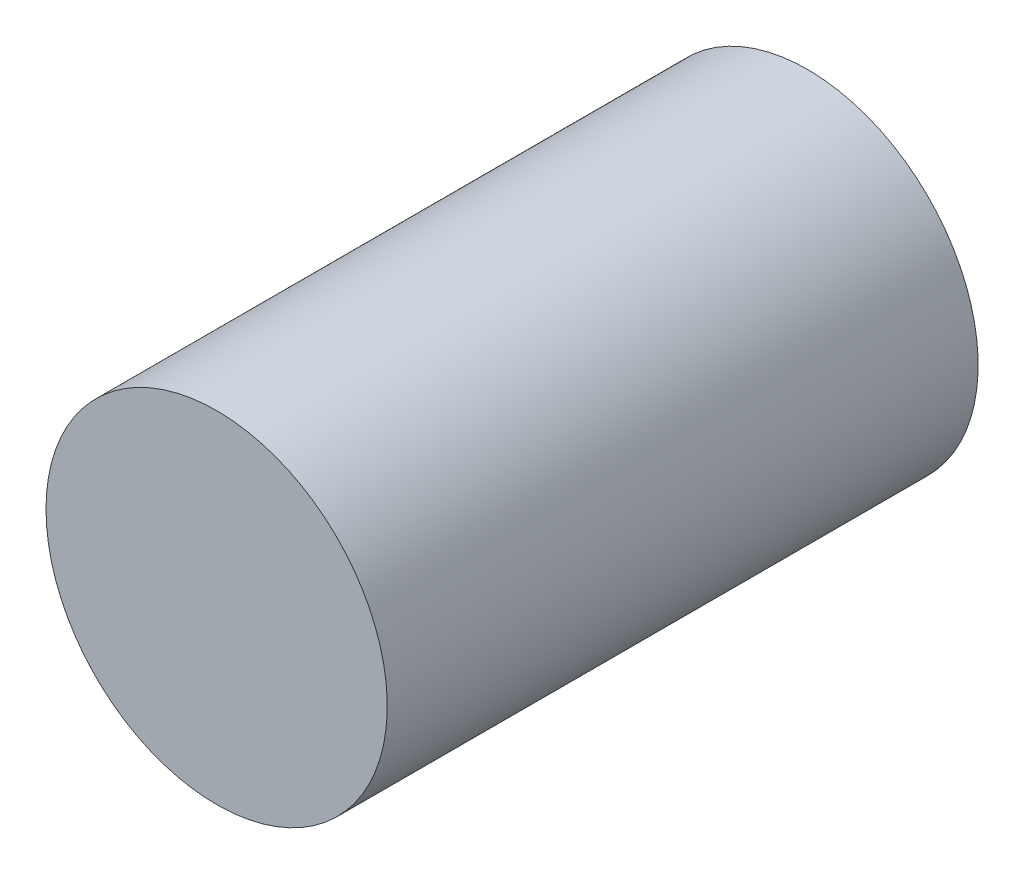
ISO-10303-21;
HEADER;
FILE_DESCRIPTION(('STEP AP214'),'2;1');
FILE_NAME('part.step','',(''),(''),'','','');
FILE_SCHEMA(('AUTOMOTIVE_DESIGN { 1 0 10303 214 1 1 1 1 }'));
ENDSEC;
DATA;
#1=APPLICATION_CONTEXT('core data for automotive mechanical design processes');
#2=APPLICATION_PROTOCOL_DEFINITION('international standard','automotive_design',2000,#1);
#3=PRODUCT_CONTEXT('',#1,'mechanical');
#4=PRODUCT('Part','Part','',(#3));
#5=PRODUCT_RELATED_PRODUCT_CATEGORY('part','',(#4));
#6=PRODUCT_DEFINITION_FORMATION('','',#4);
#7=PRODUCT_DEFINITION_CONTEXT('part definition',#1,'design');
#8=PRODUCT_DEFINITION('design','',#6,#7);
#9=PRODUCT_DEFINITION_SHAPE('','',#8);
#10=(LENGTH_UNIT() NAMED_UNIT(*) SI_UNIT(.MILLI.,.METRE.));
#11=(NAMED_UNIT(*) PLANE_ANGLE_UNIT() SI_UNIT($,.RADIAN.));
#12=(NAMED_UNIT(*) SI_UNIT($,.STERADIAN.) SOLID_ANGLE_UNIT());
#13=UNCERTAINTY_MEASURE_WITH_UNIT(LENGTH_MEASURE(1.E-05),#10,'distance_accuracy_value','');
#14=(GEOMETRIC_REPRESENTATION_CONTEXT(3) GLOBAL_UNCERTAINTY_ASSIGNED_CONTEXT((#13)) GLOBAL_UNIT_ASSIGNED_CONTEXT((#10,
#11,#12)) REPRESENTATION_CONTEXT('',''));
#15=CARTESIAN_POINT('',(0.,0.,0.));
#16=DIRECTION('',(0.,0.,1.));
#17=DIRECTION('',(1.,0.,0.));
#18=AXIS2_PLACEMENT_3D('',#15,#16,#17);
#19=CARTESIAN_POINT('',(0.,0.,60.));
#20=DIRECTION('',(0.,0.,-1.));
#21=DIRECTION('',(-1.,0.,0.));
#22=AXIS2_PLACEMENT_3D('',#19,#20,#21);
#23=CYLINDRICAL_SURFACE('',#22,17.325);
#24=CARTESIAN_POINT('',(0.,0.,60.));
#25=DIRECTION('',(0.,0.,1.));
#26=DIRECTION('',(1.,0.,0.));
#27=AXIS2_PLACEMENT_3D('',#24,#25,#26);
#28=CIRCLE('',#27,17.325);
#29=CARTESIAN_POINT('',(-17.325,0.,60.));
#30=VERTEX_POINT('',#29);
#31=EDGE_CURVE('E10',#30,#30,#28,.T.);
#32=CARTESIAN_POINT('',(0.,0.,0.));
#33=DIRECTION('',(0.,0.,1.));
#34=DIRECTION('',(1.,0.,0.));
#35=AXIS2_PLACEMENT_3D('',#32,#33,#34);
#36=CIRCLE('',#35,17.325);
#37=CARTESIAN_POINT('',(-17.325,0.,0.));
#38=VERTEX_POINT('',#37);
#39=EDGE_CURVE('E34',#38,#38,#36,.T.);
#40=CARTESIAN_POINT('',(-17.325,0.,60.));
#41=CARTESIAN_POINT('',(-17.325,0.,59.375));
#42=CARTESIAN_POINT('',(-17.325,0.,58.75));
#43=CARTESIAN_POINT('',(-17.325,0.,57.5));
#44=CARTESIAN_POINT('',(-17.325,0.,56.875));
#45=CARTESIAN_POINT('',(-17.325,0.,55.625));
#46=CARTESIAN_POINT('',(-17.325,0.,55.));
#47=CARTESIAN_POINT('',(-17.325,0.,53.75));
#48=CARTESIAN_POINT('',(-17.325,0.,53.125));
#49=CARTESIAN_POINT('',(-17.325,0.,51.875));
#50=CARTESIAN_POINT('',(-17.325,0.,51.25));
#51=CARTESIAN_POINT('',(-17.325,0.,50.));
#52=CARTESIAN_POINT('',(-17.325,0.,49.375));
#53=CARTESIAN_POINT('',(-17.325,0.,48.125));
#54=CARTESIAN_POINT('',(-17.325,0.,47.5));
#55=CARTESIAN_POINT('',(-17.325,0.,46.25));
#56=CARTESIAN_POINT('',(-17.325,0.,45.625));
#57=CARTESIAN_POINT('',(-17.325,0.,44.375));
#58=CARTESIAN_POINT('',(-17.325,0.,43.75));
#59=CARTESIAN_POINT('',(-17.325,0.,42.5));
#60=CARTESIAN_POINT('',(-17.325,0.,41.875));
#61=CARTESIAN_POINT('',(-17.325,0.,40.625));
#62=CARTESIAN_POINT('',(-17.325,0.,40.));
#63=CARTESIAN_POINT('',(-17.325,0.,38.75));
#64=CARTESIAN_POINT('',(-17.325,0.,38.125));
#65=CARTESIAN_POINT('',(-17.325,0.,36.875));
#66=CARTESIAN_POINT('',(-17.325,0.,36.25));
#67=CARTESIAN_POINT('',(-17.325,0.,35.));
#68=CARTESIAN_POINT('',(-17.325,0.,34.375));
#69=CARTESIAN_POINT('',(-17.325,0.,33.125));
#70=CARTESIAN_POINT('',(-17.325,0.,32.5));
#71=CARTESIAN_POINT('',(-17.325,0.,31.25));
#72=CARTESIAN_POINT('',(-17.325,0.,30.625));
#73=CARTESIAN_POINT('',(-17.325,0.,29.375));
#74=CARTESIAN_POINT('',(-17.325,0.,28.75));
#75=CARTESIAN_POINT('',(-17.325,0.,27.5));
#76=CARTESIAN_POINT('',(-17.325,0.,26.875));
#77=CARTESIAN_POINT('',(-17.325,0.,25.625));
#78=CARTESIAN_POINT('',(-17.325,0.,25.));
#79=CARTESIAN_POINT('',(-17.325,0.,23.75));
#80=CARTESIAN_POINT('',(-17.325,0.,23.125));
#81=CARTESIAN_POINT('',(-17.325,0.,21.875));
#82=CARTESIAN_POINT('',(-17.325,0.,21.25));
#83=CARTESIAN_POINT('',(-17.325,0.,20.));
#84=CARTESIAN_POINT('',(-17.325,0.,19.375));
#85=CARTESIAN_POINT('',(-17.325,0.,18.125));
#86=CARTESIAN_POINT('',(-17.325,0.,17.5));
#87=CARTESIAN_POINT('',(-17.325,0.,16.25));
#88=CARTESIAN_POINT('',(-17.325,0.,15.625));
#89=CARTESIAN_POINT('',(-17.325,0.,14.375));
#90=CARTESIAN_POINT('',(-17.325,0.,13.75));
#91=CARTESIAN_POINT('',(-17.325,0.,12.5));
#92=CARTESIAN_POINT('',(-17.325,0.,11.875));
#93=CARTESIAN_POINT('',(-17.325,0.,10.625));
#94=CARTESIAN_POINT('',(-17.325,0.,10.));
#95=CARTESIAN_POINT('',(-17.325,0.,8.75));
#96=CARTESIAN_POINT('',(-17.325,0.,8.125));
#97=CARTESIAN_POINT('',(-17.325,0.,6.875));
#98=CARTESIAN_POINT('',(-17.325,0.,6.25));
#99=CARTESIAN_POINT('',(-17.325,0.,5.));
#100=CARTESIAN_POINT('',(-17.325,0.,4.375));
#101=CARTESIAN_POINT('',(-17.325,0.,3.125));
#102=CARTESIAN_POINT('',(-17.325,0.,2.5));
#103=CARTESIAN_POINT('',(-17.325,0.,1.25));
#104=CARTESIAN_POINT('',(-17.325,0.,0.625000000000001));
#105=CARTESIAN_POINT('',(-17.325,0.,0.));
#106=B_SPLINE_CURVE_WITH_KNOTS('',3,(#40,#41,#42,#43,#44,#45,#46,#47,#48,#49,#50,#51,#52,#53,
#54,#55,#56,#57,#58,#59,#60,#61,#62,#63,#64,#65,#66,#67,#68,#69,#70,#71,#72,#73,#74,#75,#76,#77,
#78,#79,#80,#81,#82,#83,#84,#85,#86,#87,#88,#89,#90,#91,#92,#93,#94,#95,#96,#97,#98,#99,#100,
#101,#102,#103,#104,#105),.UNSPECIFIED.,.F.,.F.,(4,2,2,2,2,2,2,2,2,2,2,2,2,2,2,2,2,2,2,2,2,2,2,
2,2,2,2,2,2,2,2,2,4),(0.,1.875,3.75,5.62500000000001,7.50000000000001,9.375,11.25,13.125,15.,
16.875,18.75,20.625,22.5,24.375,26.25,28.125,30.,31.875,33.75,35.625,37.5,39.375,41.25,43.125,
45.,46.875,48.75,50.625,52.5,54.375,56.25,58.125,60.),.UNSPECIFIED.);
#107=EDGE_CURVE('BSEAM31',#30,#38,#106,.T.);
#108=ORIENTED_EDGE('',*,*,#31,.F.);
#109=ORIENTED_EDGE('',*,*,#39,.T.);
#110=ORIENTED_EDGE('',*,*,#107,.T.);
#111=ORIENTED_EDGE('',*,*,#107,.F.);
#112=EDGE_LOOP('',(#108,#110,#109,#111));
#113=FACE_BOUND('',#112,.T.);
#114=ADVANCED_FACE('F31',(#113),#23,.T.);
#115=CARTESIAN_POINT('',(0.,0.,60.));
#116=DIRECTION('',(0.,0.,1.));
#117=DIRECTION('',(1.,0.,0.));
#118=AXIS2_PLACEMENT_3D('',#115,#116,#117);
#119=PLANE('',#118);
#120=ORIENTED_EDGE('',*,*,#31,.T.);
#121=EDGE_LOOP('',(#120));
#122=FACE_BOUND('',#121,.T.);
#123=ADVANCED_FACE('F46',(#122),#119,.T.);
#124=CARTESIAN_POINT('',(0.,0.,0.));
#125=DIRECTION('',(0.,0.,1.));
#126=DIRECTION('',(1.,0.,0.));
#127=AXIS2_PLACEMENT_3D('',#124,#125,#126);
#128=PLANE('',#127);
#129=ORIENTED_EDGE('',*,*,#39,.F.);
#130=EDGE_LOOP('',(#129));
#131=FACE_BOUND('',#130,.T.);
#132=ADVANCED_FACE('F44',(#131),#128,.F.);
#133=CLOSED_SHELL('',(#114,#123,#132));
#134=MANIFOLD_SOLID_BREP('B2',#133);
#135=ADVANCED_BREP_SHAPE_REPRESENTATION('',(#18,#134),#14);
#136=SHAPE_DEFINITION_REPRESENTATION(#9,#135);
ENDSEC;
END-ISO-10303-21;
